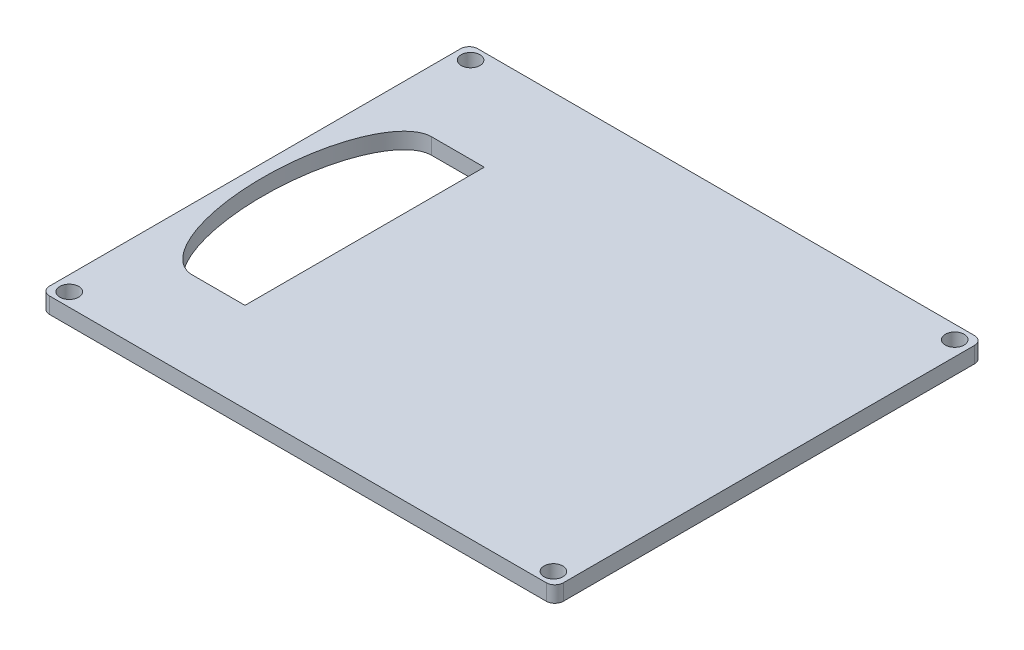
ISO-10303-21;
HEADER;
FILE_DESCRIPTION(('STEP AP214'),'2;1');
FILE_NAME('part.step','',(''),(''),'','','');
FILE_SCHEMA(('AUTOMOTIVE_DESIGN { 1 0 10303 214 1 1 1 1 }'));
ENDSEC;
DATA;
#1=APPLICATION_CONTEXT('core data for automotive mechanical design processes');
#2=APPLICATION_PROTOCOL_DEFINITION('international standard','automotive_design',2000,#1);
#3=PRODUCT_CONTEXT('',#1,'mechanical');
#4=PRODUCT('Part','Part','',(#3));
#5=PRODUCT_RELATED_PRODUCT_CATEGORY('part','',(#4));
#6=PRODUCT_DEFINITION_FORMATION('','',#4);
#7=PRODUCT_DEFINITION_CONTEXT('part definition',#1,'design');
#8=PRODUCT_DEFINITION('design','',#6,#7);
#9=PRODUCT_DEFINITION_SHAPE('','',#8);
#10=(LENGTH_UNIT() NAMED_UNIT(*) SI_UNIT(.MILLI.,.METRE.));
#11=(NAMED_UNIT(*) PLANE_ANGLE_UNIT() SI_UNIT($,.RADIAN.));
#12=(NAMED_UNIT(*) SI_UNIT($,.STERADIAN.) SOLID_ANGLE_UNIT());
#13=UNCERTAINTY_MEASURE_WITH_UNIT(LENGTH_MEASURE(1.E-05),#10,'distance_accuracy_value','');
#14=(GEOMETRIC_REPRESENTATION_CONTEXT(3) GLOBAL_UNCERTAINTY_ASSIGNED_CONTEXT((#13)) GLOBAL_UNIT_ASSIGNED_CONTEXT((#10,
#11,#12)) REPRESENTATION_CONTEXT('',''));
#15=CARTESIAN_POINT('',(0.,0.,0.));
#16=DIRECTION('',(0.,0.,1.));
#17=DIRECTION('',(1.,0.,0.));
#18=AXIS2_PLACEMENT_3D('',#15,#16,#17);
#19=CARTESIAN_POINT('',(76.2,4.7625,-63.5));
#20=DIRECTION('',(-1.,0.,0.));
#21=DIRECTION('',(0.,0.,1.));
#22=AXIS2_PLACEMENT_3D('',#19,#20,#21);
#23=PLANE('',#22);
#24=DIRECTION('',(0.,0.,-1.));
#25=VECTOR('',#24,1.);
#26=CARTESIAN_POINT('',(76.2,4.7625,-63.5));
#27=LINE('',#26,#25);
#28=CARTESIAN_POINT('',(76.2,4.7625,60.96));
#29=VERTEX_POINT('',#28);
#30=CARTESIAN_POINT('',(76.2,4.7625,-60.96));
#31=VERTEX_POINT('',#30);
#32=EDGE_CURVE('E189',#29,#31,#27,.T.);
#33=ORIENTED_EDGE('',*,*,#32,.F.);
#34=DIRECTION('',(0.,-1.,0.));
#35=VECTOR('',#34,1.);
#36=CARTESIAN_POINT('',(76.2,4.7625,60.96));
#37=LINE('',#36,#35);
#38=CARTESIAN_POINT('',(76.2,0.,60.96));
#39=VERTEX_POINT('',#38);
#40=EDGE_CURVE('E294',#29,#39,#37,.T.);
#41=ORIENTED_EDGE('',*,*,#40,.T.);
#42=DIRECTION('',(0.,0.,-1.));
#43=VECTOR('',#42,1.);
#44=CARTESIAN_POINT('',(76.2,0.,-63.5));
#45=LINE('',#44,#43);
#46=CARTESIAN_POINT('',(76.2,0.,-60.96));
#47=VERTEX_POINT('',#46);
#48=EDGE_CURVE('E186',#39,#47,#45,.T.);
#49=ORIENTED_EDGE('',*,*,#48,.T.);
#50=DIRECTION('',(0.,-1.,0.));
#51=VECTOR('',#50,1.);
#52=CARTESIAN_POINT('',(76.2,4.7625,-60.96));
#53=LINE('',#52,#51);
#54=EDGE_CURVE('E280',#47,#31,#53,.F.);
#55=ORIENTED_EDGE('',*,*,#54,.T.);
#56=EDGE_LOOP('',(#33,#41,#49,#55));
#57=FACE_BOUND('',#56,.T.);
#58=ADVANCED_FACE('F41',(#57),#23,.F.);
#59=CARTESIAN_POINT('',(-76.2,4.7625,-63.5));
#60=DIRECTION('',(0.,0.,1.));
#61=DIRECTION('',(1.,0.,0.));
#62=AXIS2_PLACEMENT_3D('',#59,#60,#61);
#63=PLANE('',#62);
#64=DIRECTION('',(-1.,0.,0.));
#65=VECTOR('',#64,1.);
#66=CARTESIAN_POINT('',(-76.2,4.7625,-63.5));
#67=LINE('',#66,#65);
#68=CARTESIAN_POINT('',(73.66,4.7625,-63.5));
#69=VERTEX_POINT('',#68);
#70=CARTESIAN_POINT('',(-73.66,4.7625,-63.5));
#71=VERTEX_POINT('',#70);
#72=EDGE_CURVE('E192',#69,#71,#67,.T.);
#73=ORIENTED_EDGE('',*,*,#72,.F.);
#74=DIRECTION('',(0.,-1.,0.));
#75=VECTOR('',#74,1.);
#76=CARTESIAN_POINT('',(73.66,4.7625,-63.5));
#77=LINE('',#76,#75);
#78=CARTESIAN_POINT('',(73.66,0.,-63.5));
#79=VERTEX_POINT('',#78);
#80=EDGE_CURVE('E12',#69,#79,#77,.T.);
#81=ORIENTED_EDGE('',*,*,#80,.T.);
#82=DIRECTION('',(-1.,0.,0.));
#83=VECTOR('',#82,1.);
#84=CARTESIAN_POINT('',(-76.2,0.,-63.5));
#85=LINE('',#84,#83);
#86=CARTESIAN_POINT('',(-73.66,0.,-63.5));
#87=VERTEX_POINT('',#86);
#88=EDGE_CURVE('E206',#79,#87,#85,.T.);
#89=ORIENTED_EDGE('',*,*,#88,.T.);
#90=DIRECTION('',(0.,-1.,0.));
#91=VECTOR('',#90,1.);
#92=CARTESIAN_POINT('',(-73.66,4.7625,-63.5));
#93=LINE('',#92,#91);
#94=EDGE_CURVE('E49',#87,#71,#93,.F.);
#95=ORIENTED_EDGE('',*,*,#94,.T.);
#96=EDGE_LOOP('',(#73,#81,#89,#95));
#97=FACE_BOUND('',#96,.T.);
#98=ADVANCED_FACE('F255',(#97),#63,.F.);
#99=CARTESIAN_POINT('',(-76.2,4.7625,-63.5));
#100=DIRECTION('',(1.,0.,0.));
#101=DIRECTION('',(0.,0.,-1.));
#102=AXIS2_PLACEMENT_3D('',#99,#100,#101);
#103=PLANE('',#102);
#104=DIRECTION('',(0.,0.,1.));
#105=VECTOR('',#104,1.);
#106=CARTESIAN_POINT('',(-76.2,0.,-63.5));
#107=LINE('',#106,#105);
#108=CARTESIAN_POINT('',(-76.2,0.,-60.96));
#109=VERTEX_POINT('',#108);
#110=CARTESIAN_POINT('',(-76.2,0.,60.96));
#111=VERTEX_POINT('',#110);
#112=EDGE_CURVE('E322',#109,#111,#107,.T.);
#113=ORIENTED_EDGE('',*,*,#112,.T.);
#114=DIRECTION('',(0.,-1.,0.));
#115=VECTOR('',#114,1.);
#116=CARTESIAN_POINT('',(-76.2,4.7625,60.96));
#117=LINE('',#116,#115);
#118=CARTESIAN_POINT('',(-76.2,4.7625,60.96));
#119=VERTEX_POINT('',#118);
#120=EDGE_CURVE('E288',#111,#119,#117,.F.);
#121=ORIENTED_EDGE('',*,*,#120,.T.);
#122=DIRECTION('',(0.,0.,1.));
#123=VECTOR('',#122,1.);
#124=CARTESIAN_POINT('',(-76.2,4.7625,-63.5));
#125=LINE('',#124,#123);
#126=CARTESIAN_POINT('',(-76.2,4.7625,-60.96));
#127=VERTEX_POINT('',#126);
#128=EDGE_CURVE('E196',#127,#119,#125,.T.);
#129=ORIENTED_EDGE('',*,*,#128,.F.);
#130=DIRECTION('',(0.,-1.,0.));
#131=VECTOR('',#130,1.);
#132=CARTESIAN_POINT('',(-76.2,4.7625,-60.96));
#133=LINE('',#132,#131);
#134=EDGE_CURVE('E303',#127,#109,#133,.T.);
#135=ORIENTED_EDGE('',*,*,#134,.T.);
#136=EDGE_LOOP('',(#113,#121,#129,#135));
#137=FACE_BOUND('',#136,.T.);
#138=ADVANCED_FACE('F251',(#137),#103,.F.);
#139=CARTESIAN_POINT('',(-76.2,4.7625,63.5));
#140=DIRECTION('',(0.,0.,-1.));
#141=DIRECTION('',(-1.,0.,0.));
#142=AXIS2_PLACEMENT_3D('',#139,#140,#141);
#143=PLANE('',#142);
#144=DIRECTION('',(1.,0.,0.));
#145=VECTOR('',#144,1.);
#146=CARTESIAN_POINT('',(-76.2,4.7625,63.5));
#147=LINE('',#146,#145);
#148=CARTESIAN_POINT('',(-73.66,4.7625,63.5));
#149=VERTEX_POINT('',#148);
#150=CARTESIAN_POINT('',(73.66,4.7625,63.5));
#151=VERTEX_POINT('',#150);
#152=EDGE_CURVE('E199',#149,#151,#147,.T.);
#153=ORIENTED_EDGE('',*,*,#152,.F.);
#154=DIRECTION('',(0.,-1.,0.));
#155=VECTOR('',#154,1.);
#156=CARTESIAN_POINT('',(-73.66,4.7625,63.5));
#157=LINE('',#156,#155);
#158=CARTESIAN_POINT('',(-73.66,0.,63.5));
#159=VERTEX_POINT('',#158);
#160=EDGE_CURVE('E316',#149,#159,#157,.T.);
#161=ORIENTED_EDGE('',*,*,#160,.T.);
#162=DIRECTION('',(1.,0.,0.));
#163=VECTOR('',#162,1.);
#164=CARTESIAN_POINT('',(-76.2,0.,63.5));
#165=LINE('',#164,#163);
#166=CARTESIAN_POINT('',(73.66,0.,63.5));
#167=VERTEX_POINT('',#166);
#168=EDGE_CURVE('E193',#159,#167,#165,.T.);
#169=ORIENTED_EDGE('',*,*,#168,.T.);
#170=DIRECTION('',(0.,-1.,0.));
#171=VECTOR('',#170,1.);
#172=CARTESIAN_POINT('',(73.66,4.7625,63.5));
#173=LINE('',#172,#171);
#174=EDGE_CURVE('E202',#167,#151,#173,.F.);
#175=ORIENTED_EDGE('',*,*,#174,.T.);
#176=EDGE_LOOP('',(#153,#161,#169,#175));
#177=FACE_BOUND('',#176,.T.);
#178=ADVANCED_FACE('F245',(#177),#143,.F.);
#179=CARTESIAN_POINT('',(0.,4.7625,0.));
#180=DIRECTION('',(0.,1.,0.));
#181=DIRECTION('',(0.,0.,1.));
#182=AXIS2_PLACEMENT_3D('',#179,#180,#181);
#183=PLANE('',#182);
#184=CARTESIAN_POINT('',(-57.8578913926201,4.7625,1.44007365035895));
#185=DIRECTION('',(0.,1.,0.));
#186=DIRECTION('',(0.,0.,1.));
#187=AXIS2_PLACEMENT_3D('',#184,#185,#186);
#188=ELLIPSE('',#187,35.4844500063675,14.605);
#189=CARTESIAN_POINT('',(-57.8578913926201,4.7625,-34.0443763560085));
#190=VERTEX_POINT('',#189);
#191=CARTESIAN_POINT('',(-57.8578913926201,4.7625,36.9245236567264));
#192=VERTEX_POINT('',#191);
#193=EDGE_CURVE('E56',#190,#192,#188,.T.);
#194=ORIENTED_EDGE('',*,*,#193,.F.);
#195=DIRECTION('',(-1.,0.,0.));
#196=VECTOR('',#195,1.);
#197=CARTESIAN_POINT('',(-57.8578913926201,4.7625,-34.0443763560085));
#198=LINE('',#197,#196);
#199=CARTESIAN_POINT('',(-42.2579164672201,4.7625,-34.0443763560085));
#200=VERTEX_POINT('',#199);
#201=EDGE_CURVE('E145',#200,#190,#198,.T.);
#202=ORIENTED_EDGE('',*,*,#201,.F.);
#203=DIRECTION('',(0.,0.,-1.));
#204=VECTOR('',#203,1.);
#205=CARTESIAN_POINT('',(-42.2579164672201,4.7625,-34.0443763560085));
#206=LINE('',#205,#204);
#207=CARTESIAN_POINT('',(-42.2579164672201,4.7625,36.9245236567264));
#208=VERTEX_POINT('',#207);
#209=EDGE_CURVE('E152',#208,#200,#206,.T.);
#210=ORIENTED_EDGE('',*,*,#209,.F.);
#211=DIRECTION('',(1.,0.,0.));
#212=VECTOR('',#211,1.);
#213=CARTESIAN_POINT('',(-57.8578913926201,4.7625,36.9245236567264));
#214=LINE('',#213,#212);
#215=EDGE_CURVE('E147',#192,#208,#214,.T.);
#216=ORIENTED_EDGE('',*,*,#215,.F.);
#217=EDGE_LOOP('',(#194,#202,#210,#216));
#218=FACE_BOUND('',#217,.T.);
#219=CARTESIAN_POINT('',(-71.7948137847569,4.7625,-59.5104358344753));
#220=DIRECTION('',(0.,-1.,0.));
#221=DIRECTION('',(0.,0.,1.));
#222=AXIS2_PLACEMENT_3D('',#219,#220,#221);
#223=CIRCLE('',#222,2.79400000031772);
#224=CARTESIAN_POINT('',(-71.7948137847569,4.7625,-56.7164358341575));
#225=VERTEX_POINT('',#224);
#226=EDGE_CURVE('E136',#225,#225,#223,.T.);
#227=ORIENTED_EDGE('',*,*,#226,.T.);
#228=EDGE_LOOP('',(#227));
#229=FACE_BOUND('',#228,.T.);
#230=CARTESIAN_POINT('',(-71.794813784757,4.7625,59.5104358344751));
#231=DIRECTION('',(0.,-1.,0.));
#232=DIRECTION('',(0.,0.,1.));
#233=AXIS2_PLACEMENT_3D('',#230,#231,#232);
#234=CIRCLE('',#233,2.79400000031772);
#235=CARTESIAN_POINT('',(-71.794813784757,4.7625,62.3044358347929));
#236=VERTEX_POINT('',#235);
#237=EDGE_CURVE('E168',#236,#236,#234,.T.);
#238=ORIENTED_EDGE('',*,*,#237,.T.);
#239=EDGE_LOOP('',(#238));
#240=FACE_BOUND('',#239,.T.);
#241=CARTESIAN_POINT('',(71.7948137847569,4.7625,-59.5104358344753));
#242=DIRECTION('',(0.,1.,0.));
#243=DIRECTION('',(0.,0.,1.));
#244=AXIS2_PLACEMENT_3D('',#241,#242,#243);
#245=CIRCLE('',#244,2.79400000031772);
#246=CARTESIAN_POINT('',(71.7948137847569,4.7625,-56.7164358341575));
#247=VERTEX_POINT('',#246);
#248=EDGE_CURVE('E174',#247,#247,#245,.T.);
#249=ORIENTED_EDGE('',*,*,#248,.F.);
#250=EDGE_LOOP('',(#249));
#251=FACE_BOUND('',#250,.T.);
#252=CARTESIAN_POINT('',(71.794813784757,4.7625,59.5104358344751));
#253=DIRECTION('',(0.,1.,0.));
#254=DIRECTION('',(0.,0.,1.));
#255=AXIS2_PLACEMENT_3D('',#252,#253,#254);
#256=CIRCLE('',#255,2.79400000031772);
#257=CARTESIAN_POINT('',(71.794813784757,4.7625,62.3044358347929));
#258=VERTEX_POINT('',#257);
#259=EDGE_CURVE('E180',#258,#258,#256,.T.);
#260=ORIENTED_EDGE('',*,*,#259,.F.);
#261=EDGE_LOOP('',(#260));
#262=FACE_BOUND('',#261,.T.);
#263=ORIENTED_EDGE('',*,*,#128,.T.);
#264=CARTESIAN_POINT('',(-73.66,4.7625,60.96));
#265=DIRECTION('',(0.,1.,0.));
#266=DIRECTION('',(0.,0.,1.));
#267=AXIS2_PLACEMENT_3D('',#264,#265,#266);
#268=CIRCLE('',#267,2.54);
#269=EDGE_CURVE('E286',#119,#149,#268,.T.);
#270=ORIENTED_EDGE('',*,*,#269,.T.);
#271=ORIENTED_EDGE('',*,*,#152,.T.);
#272=CARTESIAN_POINT('',(73.66,4.7625,60.96));
#273=DIRECTION('',(0.,1.,0.));
#274=DIRECTION('',(0.,0.,1.));
#275=AXIS2_PLACEMENT_3D('',#272,#273,#274);
#276=CIRCLE('',#275,2.54);
#277=EDGE_CURVE('E283',#151,#29,#276,.T.);
#278=ORIENTED_EDGE('',*,*,#277,.T.);
#279=ORIENTED_EDGE('',*,*,#32,.T.);
#280=CARTESIAN_POINT('',(73.66,4.7625,-60.96));
#281=DIRECTION('',(0.,1.,0.));
#282=DIRECTION('',(0.,0.,1.));
#283=AXIS2_PLACEMENT_3D('',#280,#281,#282);
#284=CIRCLE('',#283,2.54);
#285=EDGE_CURVE('E279',#31,#69,#284,.T.);
#286=ORIENTED_EDGE('',*,*,#285,.T.);
#287=ORIENTED_EDGE('',*,*,#72,.T.);
#288=CARTESIAN_POINT('',(-73.66,4.7625,-60.96));
#289=DIRECTION('',(0.,1.,0.));
#290=DIRECTION('',(0.,0.,1.));
#291=AXIS2_PLACEMENT_3D('',#288,#289,#290);
#292=CIRCLE('',#291,2.54);
#293=EDGE_CURVE('E284',#71,#127,#292,.T.);
#294=ORIENTED_EDGE('',*,*,#293,.T.);
#295=EDGE_LOOP('',(#263,#270,#271,#278,#279,#286,#287,#294));
#296=FACE_BOUND('',#295,.T.);
#297=ADVANCED_FACE('F142',(#218,#229,#240,#251,#262,#296),#183,.T.);
#298=CARTESIAN_POINT('',(0.,0.,0.));
#299=DIRECTION('',(0.,1.,0.));
#300=DIRECTION('',(0.,0.,1.));
#301=AXIS2_PLACEMENT_3D('',#298,#299,#300);
#302=PLANE('',#301);
#303=DIRECTION('',(-1.,0.,0.));
#304=VECTOR('',#303,1.);
#305=CARTESIAN_POINT('',(-57.8578913926201,0.,-34.0443763560085));
#306=LINE('',#305,#304);
#307=CARTESIAN_POINT('',(-42.2579164672201,0.,-34.0443763560085));
#308=VERTEX_POINT('',#307);
#309=CARTESIAN_POINT('',(-57.8578913926201,0.,-34.0443763560085));
#310=VERTEX_POINT('',#309);
#311=EDGE_CURVE('E164',#308,#310,#306,.T.);
#312=ORIENTED_EDGE('',*,*,#311,.T.);
#313=CARTESIAN_POINT('',(-57.8578913926201,0.,1.44007365035895));
#314=DIRECTION('',(0.,1.,0.));
#315=DIRECTION('',(0.,0.,1.));
#316=AXIS2_PLACEMENT_3D('',#313,#314,#315);
#317=ELLIPSE('',#316,35.4844500063675,14.605);
#318=CARTESIAN_POINT('',(-57.8578913926201,0.,36.9245236567264));
#319=VERTEX_POINT('',#318);
#320=EDGE_CURVE('E131',#310,#319,#317,.T.);
#321=ORIENTED_EDGE('',*,*,#320,.T.);
#322=DIRECTION('',(1.,0.,0.));
#323=VECTOR('',#322,1.);
#324=CARTESIAN_POINT('',(-57.8578913926201,0.,36.9245236567264));
#325=LINE('',#324,#323);
#326=CARTESIAN_POINT('',(-42.2579164672201,0.,36.9245236567264));
#327=VERTEX_POINT('',#326);
#328=EDGE_CURVE('E151',#319,#327,#325,.T.);
#329=ORIENTED_EDGE('',*,*,#328,.T.);
#330=DIRECTION('',(0.,0.,-1.));
#331=VECTOR('',#330,1.);
#332=CARTESIAN_POINT('',(-42.2579164672201,0.,-34.0443763560085));
#333=LINE('',#332,#331);
#334=EDGE_CURVE('E64',#327,#308,#333,.T.);
#335=ORIENTED_EDGE('',*,*,#334,.T.);
#336=EDGE_LOOP('',(#312,#321,#329,#335));
#337=FACE_BOUND('',#336,.T.);
#338=CARTESIAN_POINT('',(-71.7948137847569,0.,-59.5104358344753));
#339=DIRECTION('',(0.,-1.,0.));
#340=DIRECTION('',(0.,0.,1.));
#341=AXIS2_PLACEMENT_3D('',#338,#339,#340);
#342=CIRCLE('',#341,2.79400000031772);
#343=CARTESIAN_POINT('',(-71.7948137847569,0.,-56.7164358341575));
#344=VERTEX_POINT('',#343);
#345=EDGE_CURVE('E165',#344,#344,#342,.T.);
#346=ORIENTED_EDGE('',*,*,#345,.F.);
#347=EDGE_LOOP('',(#346));
#348=FACE_BOUND('',#347,.T.);
#349=CARTESIAN_POINT('',(-71.794813784757,0.,59.5104358344751));
#350=DIRECTION('',(0.,-1.,0.));
#351=DIRECTION('',(0.,0.,1.));
#352=AXIS2_PLACEMENT_3D('',#349,#350,#351);
#353=CIRCLE('',#352,2.79400000031772);
#354=CARTESIAN_POINT('',(-71.794813784757,0.,62.3044358347929));
#355=VERTEX_POINT('',#354);
#356=EDGE_CURVE('E171',#355,#355,#353,.T.);
#357=ORIENTED_EDGE('',*,*,#356,.F.);
#358=EDGE_LOOP('',(#357));
#359=FACE_BOUND('',#358,.T.);
#360=CARTESIAN_POINT('',(71.7948137847569,0.,-59.5104358344753));
#361=DIRECTION('',(0.,1.,0.));
#362=DIRECTION('',(0.,0.,1.));
#363=AXIS2_PLACEMENT_3D('',#360,#361,#362);
#364=CIRCLE('',#363,2.79400000031772);
#365=CARTESIAN_POINT('',(71.7948137847569,0.,-56.7164358341575));
#366=VERTEX_POINT('',#365);
#367=EDGE_CURVE('E177',#366,#366,#364,.T.);
#368=ORIENTED_EDGE('',*,*,#367,.T.);
#369=EDGE_LOOP('',(#368));
#370=FACE_BOUND('',#369,.T.);
#371=CARTESIAN_POINT('',(71.794813784757,0.,59.5104358344751));
#372=DIRECTION('',(0.,1.,0.));
#373=DIRECTION('',(0.,0.,1.));
#374=AXIS2_PLACEMENT_3D('',#371,#372,#373);
#375=CIRCLE('',#374,2.79400000031772);
#376=CARTESIAN_POINT('',(71.794813784757,0.,62.3044358347929));
#377=VERTEX_POINT('',#376);
#378=EDGE_CURVE('E183',#377,#377,#375,.T.);
#379=ORIENTED_EDGE('',*,*,#378,.T.);
#380=EDGE_LOOP('',(#379));
#381=FACE_BOUND('',#380,.T.);
#382=ORIENTED_EDGE('',*,*,#168,.F.);
#383=CARTESIAN_POINT('',(-73.66,0.,60.96));
#384=DIRECTION('',(0.,1.,0.));
#385=DIRECTION('',(0.,0.,1.));
#386=AXIS2_PLACEMENT_3D('',#383,#384,#385);
#387=CIRCLE('',#386,2.54);
#388=EDGE_CURVE('E307',#159,#111,#387,.F.);
#389=ORIENTED_EDGE('',*,*,#388,.T.);
#390=ORIENTED_EDGE('',*,*,#112,.F.);
#391=CARTESIAN_POINT('',(-73.66,0.,-60.96));
#392=DIRECTION('',(0.,1.,0.));
#393=DIRECTION('',(0.,0.,1.));
#394=AXIS2_PLACEMENT_3D('',#391,#392,#393);
#395=CIRCLE('',#394,2.54);
#396=EDGE_CURVE('E304',#109,#87,#395,.F.);
#397=ORIENTED_EDGE('',*,*,#396,.T.);
#398=ORIENTED_EDGE('',*,*,#88,.F.);
#399=CARTESIAN_POINT('',(73.66,0.,-60.96));
#400=DIRECTION('',(0.,1.,0.));
#401=DIRECTION('',(0.,0.,1.));
#402=AXIS2_PLACEMENT_3D('',#399,#400,#401);
#403=CIRCLE('',#402,2.54);
#404=EDGE_CURVE('E313',#79,#47,#403,.F.);
#405=ORIENTED_EDGE('',*,*,#404,.T.);
#406=ORIENTED_EDGE('',*,*,#48,.F.);
#407=CARTESIAN_POINT('',(73.66,0.,60.96));
#408=DIRECTION('',(0.,1.,0.));
#409=DIRECTION('',(0.,0.,1.));
#410=AXIS2_PLACEMENT_3D('',#407,#408,#409);
#411=CIRCLE('',#410,2.54);
#412=EDGE_CURVE('E309',#39,#167,#411,.F.);
#413=ORIENTED_EDGE('',*,*,#412,.T.);
#414=EDGE_LOOP('',(#382,#389,#390,#397,#398,#405,#406,#413));
#415=FACE_BOUND('',#414,.T.);
#416=ADVANCED_FACE('F241',(#337,#348,#359,#370,#381,#415),#302,.F.);
#417=CARTESIAN_POINT('',(71.794813784757,0.,59.5104358344751));
#418=DIRECTION('',(0.,1.,0.));
#419=DIRECTION('',(0.,0.,1.));
#420=AXIS2_PLACEMENT_3D('',#417,#418,#419);
#421=CYLINDRICAL_SURFACE('',#420,2.79400000031772);
#422=CARTESIAN_POINT('',(71.794813784757,0.,62.3044358347929));
#423=CARTESIAN_POINT('',(71.794813784757,0.049609375,62.3044358347929));
#424=CARTESIAN_POINT('',(71.794813784757,0.09921875,62.3044358347929));
#425=CARTESIAN_POINT('',(71.794813784757,0.1984375,62.3044358347929));
#426=CARTESIAN_POINT('',(71.794813784757,0.248046875,62.3044358347929));
#427=CARTESIAN_POINT('',(71.794813784757,0.347265625,62.3044358347929));
#428=CARTESIAN_POINT('',(71.794813784757,0.396875,62.3044358347929));
#429=CARTESIAN_POINT('',(71.794813784757,0.49609375,62.3044358347929));
#430=CARTESIAN_POINT('',(71.794813784757,0.545703125,62.3044358347929));
#431=CARTESIAN_POINT('',(71.794813784757,0.644921875,62.3044358347929));
#432=CARTESIAN_POINT('',(71.794813784757,0.69453125,62.3044358347929));
#433=CARTESIAN_POINT('',(71.794813784757,0.79375,62.3044358347929));
#434=CARTESIAN_POINT('',(71.794813784757,0.843359375,62.3044358347929));
#435=CARTESIAN_POINT('',(71.794813784757,0.942578125,62.3044358347929));
#436=CARTESIAN_POINT('',(71.794813784757,0.9921875,62.3044358347929));
#437=CARTESIAN_POINT('',(71.794813784757,1.09140625,62.3044358347929));
#438=CARTESIAN_POINT('',(71.794813784757,1.141015625,62.3044358347929));
#439=CARTESIAN_POINT('',(71.794813784757,1.240234375,62.3044358347929));
#440=CARTESIAN_POINT('',(71.794813784757,1.28984375,62.3044358347929));
#441=CARTESIAN_POINT('',(71.794813784757,1.3890625,62.3044358347929));
#442=CARTESIAN_POINT('',(71.794813784757,1.438671875,62.3044358347929));
#443=CARTESIAN_POINT('',(71.794813784757,1.537890625,62.3044358347929));
#444=CARTESIAN_POINT('',(71.794813784757,1.5875,62.3044358347929));
#445=CARTESIAN_POINT('',(71.794813784757,1.68671875,62.3044358347929));
#446=CARTESIAN_POINT('',(71.794813784757,1.736328125,62.3044358347929));
#447=CARTESIAN_POINT('',(71.794813784757,1.835546875,62.3044358347929));
#448=CARTESIAN_POINT('',(71.794813784757,1.88515625,62.3044358347929));
#449=CARTESIAN_POINT('',(71.794813784757,1.984375,62.3044358347929));
#450=CARTESIAN_POINT('',(71.794813784757,2.033984375,62.3044358347929));
#451=CARTESIAN_POINT('',(71.794813784757,2.133203125,62.3044358347929));
#452=CARTESIAN_POINT('',(71.794813784757,2.1828125,62.3044358347929));
#453=CARTESIAN_POINT('',(71.794813784757,2.28203125,62.3044358347929));
#454=CARTESIAN_POINT('',(71.794813784757,2.331640625,62.3044358347929));
#455=CARTESIAN_POINT('',(71.794813784757,2.430859375,62.3044358347929));
#456=CARTESIAN_POINT('',(71.794813784757,2.48046875,62.3044358347929));
#457=CARTESIAN_POINT('',(71.794813784757,2.5796875,62.3044358347929));
#458=CARTESIAN_POINT('',(71.794813784757,2.629296875,62.3044358347929));
#459=CARTESIAN_POINT('',(71.794813784757,2.728515625,62.3044358347929));
#460=CARTESIAN_POINT('',(71.794813784757,2.778125,62.3044358347929));
#461=CARTESIAN_POINT('',(71.794813784757,2.87734375,62.3044358347929));
#462=CARTESIAN_POINT('',(71.794813784757,2.926953125,62.3044358347929));
#463=CARTESIAN_POINT('',(71.794813784757,3.026171875,62.3044358347929));
#464=CARTESIAN_POINT('',(71.794813784757,3.07578125,62.3044358347929));
#465=CARTESIAN_POINT('',(71.794813784757,3.175,62.3044358347929));
#466=CARTESIAN_POINT('',(71.794813784757,3.224609375,62.3044358347929));
#467=CARTESIAN_POINT('',(71.794813784757,3.323828125,62.3044358347929));
#468=CARTESIAN_POINT('',(71.794813784757,3.3734375,62.3044358347929));
#469=CARTESIAN_POINT('',(71.794813784757,3.47265625,62.3044358347929));
#470=CARTESIAN_POINT('',(71.794813784757,3.522265625,62.3044358347929));
#471=CARTESIAN_POINT('',(71.794813784757,3.621484375,62.3044358347929));
#472=CARTESIAN_POINT('',(71.794813784757,3.67109375,62.3044358347929));
#473=CARTESIAN_POINT('',(71.794813784757,3.7703125,62.3044358347929));
#474=CARTESIAN_POINT('',(71.794813784757,3.819921875,62.3044358347929));
#475=CARTESIAN_POINT('',(71.794813784757,3.919140625,62.3044358347929));
#476=CARTESIAN_POINT('',(71.794813784757,3.96875,62.3044358347929));
#477=CARTESIAN_POINT('',(71.794813784757,4.06796875,62.3044358347929));
#478=CARTESIAN_POINT('',(71.794813784757,4.117578125,62.3044358347929));
#479=CARTESIAN_POINT('',(71.794813784757,4.216796875,62.3044358347929));
#480=CARTESIAN_POINT('',(71.794813784757,4.26640625,62.3044358347929));
#481=CARTESIAN_POINT('',(71.794813784757,4.365625,62.3044358347929));
#482=CARTESIAN_POINT('',(71.794813784757,4.415234375,62.3044358347929));
#483=CARTESIAN_POINT('',(71.794813784757,4.514453125,62.3044358347929));
#484=CARTESIAN_POINT('',(71.794813784757,4.5640625,62.3044358347929));
#485=CARTESIAN_POINT('',(71.794813784757,4.66328125,62.3044358347929));
#486=CARTESIAN_POINT('',(71.794813784757,4.712890625,62.3044358347929));
#487=CARTESIAN_POINT('',(71.794813784757,4.7625,62.3044358347929));
#488=B_SPLINE_CURVE_WITH_KNOTS('',3,(#422,#423,#424,#425,#426,#427,#428,#429,#430,#431,#432,
#433,#434,#435,#436,#437,#438,#439,#440,#441,#442,#443,#444,#445,#446,#447,#448,#449,#450,#451,
#452,#453,#454,#455,#456,#457,#458,#459,#460,#461,#462,#463,#464,#465,#466,#467,#468,#469,#470,
#471,#472,#473,#474,#475,#476,#477,#478,#479,#480,#481,#482,#483,#484,#485,#486,#487),
.UNSPECIFIED.,.F.,.F.,(4,2,2,2,2,2,2,2,2,2,2,2,2,2,2,2,2,2,2,2,2,2,2,2,2,2,2,2,2,2,2,2,4),(0.,
0.148828125,0.29765625,0.446484375,0.5953125,0.744140625,0.89296875,1.041796875,1.190625,
1.339453125,1.48828125,1.637109375,1.7859375,1.934765625,2.08359375,2.232421875,2.38125,
2.530078125,2.67890625,2.827734375,2.9765625,3.125390625,3.27421875,3.423046875,3.571875,
3.720703125,3.86953125,4.018359375,4.1671875,4.316015625,4.46484375,4.613671875,4.7625),.UNSPECIFIED.);
#489=EDGE_CURVE('BSEAM237',#377,#258,#488,.T.);
#490=ORIENTED_EDGE('',*,*,#378,.F.);
#491=ORIENTED_EDGE('',*,*,#259,.T.);
#492=ORIENTED_EDGE('',*,*,#489,.T.);
#493=ORIENTED_EDGE('',*,*,#489,.F.);
#494=EDGE_LOOP('',(#490,#492,#491,#493));
#495=FACE_BOUND('',#494,.T.);
#496=ADVANCED_FACE('F237',(#495),#421,.F.);
#497=CARTESIAN_POINT('',(71.7948137847569,0.,-59.5104358344753));
#498=DIRECTION('',(0.,1.,0.));
#499=DIRECTION('',(0.,0.,1.));
#500=AXIS2_PLACEMENT_3D('',#497,#498,#499);
#501=CYLINDRICAL_SURFACE('',#500,2.79400000031772);
#502=CARTESIAN_POINT('',(71.7948137847569,0.,-56.7164358341575));
#503=CARTESIAN_POINT('',(71.7948137847569,0.049609375,-56.7164358341575));
#504=CARTESIAN_POINT('',(71.7948137847569,0.09921875,-56.7164358341575));
#505=CARTESIAN_POINT('',(71.7948137847569,0.1984375,-56.7164358341575));
#506=CARTESIAN_POINT('',(71.7948137847569,0.248046875,-56.7164358341575));
#507=CARTESIAN_POINT('',(71.7948137847569,0.347265625,-56.7164358341575));
#508=CARTESIAN_POINT('',(71.7948137847569,0.396875,-56.7164358341575));
#509=CARTESIAN_POINT('',(71.7948137847569,0.49609375,-56.7164358341575));
#510=CARTESIAN_POINT('',(71.7948137847569,0.545703125,-56.7164358341575));
#511=CARTESIAN_POINT('',(71.7948137847569,0.644921875,-56.7164358341575));
#512=CARTESIAN_POINT('',(71.7948137847569,0.69453125,-56.7164358341575));
#513=CARTESIAN_POINT('',(71.7948137847569,0.79375,-56.7164358341575));
#514=CARTESIAN_POINT('',(71.7948137847569,0.843359375,-56.7164358341575));
#515=CARTESIAN_POINT('',(71.7948137847569,0.942578125,-56.7164358341575));
#516=CARTESIAN_POINT('',(71.7948137847569,0.9921875,-56.7164358341575));
#517=CARTESIAN_POINT('',(71.7948137847569,1.09140625,-56.7164358341575));
#518=CARTESIAN_POINT('',(71.7948137847569,1.141015625,-56.7164358341575));
#519=CARTESIAN_POINT('',(71.7948137847569,1.240234375,-56.7164358341575));
#520=CARTESIAN_POINT('',(71.7948137847569,1.28984375,-56.7164358341575));
#521=CARTESIAN_POINT('',(71.7948137847569,1.3890625,-56.7164358341575));
#522=CARTESIAN_POINT('',(71.7948137847569,1.438671875,-56.7164358341575));
#523=CARTESIAN_POINT('',(71.7948137847569,1.537890625,-56.7164358341575));
#524=CARTESIAN_POINT('',(71.7948137847569,1.5875,-56.7164358341575));
#525=CARTESIAN_POINT('',(71.7948137847569,1.68671875,-56.7164358341575));
#526=CARTESIAN_POINT('',(71.7948137847569,1.736328125,-56.7164358341575));
#527=CARTESIAN_POINT('',(71.7948137847569,1.835546875,-56.7164358341575));
#528=CARTESIAN_POINT('',(71.7948137847569,1.88515625,-56.7164358341575));
#529=CARTESIAN_POINT('',(71.7948137847569,1.984375,-56.7164358341575));
#530=CARTESIAN_POINT('',(71.7948137847569,2.033984375,-56.7164358341575));
#531=CARTESIAN_POINT('',(71.7948137847569,2.133203125,-56.7164358341575));
#532=CARTESIAN_POINT('',(71.7948137847569,2.1828125,-56.7164358341575));
#533=CARTESIAN_POINT('',(71.7948137847569,2.28203125,-56.7164358341575));
#534=CARTESIAN_POINT('',(71.7948137847569,2.331640625,-56.7164358341575));
#535=CARTESIAN_POINT('',(71.7948137847569,2.430859375,-56.7164358341575));
#536=CARTESIAN_POINT('',(71.7948137847569,2.48046875,-56.7164358341575));
#537=CARTESIAN_POINT('',(71.7948137847569,2.5796875,-56.7164358341575));
#538=CARTESIAN_POINT('',(71.7948137847569,2.629296875,-56.7164358341575));
#539=CARTESIAN_POINT('',(71.7948137847569,2.728515625,-56.7164358341575));
#540=CARTESIAN_POINT('',(71.7948137847569,2.778125,-56.7164358341575));
#541=CARTESIAN_POINT('',(71.7948137847569,2.87734375,-56.7164358341575));
#542=CARTESIAN_POINT('',(71.7948137847569,2.926953125,-56.7164358341575));
#543=CARTESIAN_POINT('',(71.7948137847569,3.026171875,-56.7164358341575));
#544=CARTESIAN_POINT('',(71.7948137847569,3.07578125,-56.7164358341575));
#545=CARTESIAN_POINT('',(71.7948137847569,3.175,-56.7164358341575));
#546=CARTESIAN_POINT('',(71.7948137847569,3.224609375,-56.7164358341575));
#547=CARTESIAN_POINT('',(71.7948137847569,3.323828125,-56.7164358341575));
#548=CARTESIAN_POINT('',(71.7948137847569,3.3734375,-56.7164358341575));
#549=CARTESIAN_POINT('',(71.7948137847569,3.47265625,-56.7164358341575));
#550=CARTESIAN_POINT('',(71.7948137847569,3.522265625,-56.7164358341575));
#551=CARTESIAN_POINT('',(71.7948137847569,3.621484375,-56.7164358341575));
#552=CARTESIAN_POINT('',(71.7948137847569,3.67109375,-56.7164358341575));
#553=CARTESIAN_POINT('',(71.7948137847569,3.7703125,-56.7164358341575));
#554=CARTESIAN_POINT('',(71.7948137847569,3.819921875,-56.7164358341575));
#555=CARTESIAN_POINT('',(71.7948137847569,3.919140625,-56.7164358341575));
#556=CARTESIAN_POINT('',(71.7948137847569,3.96875,-56.7164358341575));
#557=CARTESIAN_POINT('',(71.7948137847569,4.06796875,-56.7164358341575));
#558=CARTESIAN_POINT('',(71.7948137847569,4.117578125,-56.7164358341575));
#559=CARTESIAN_POINT('',(71.7948137847569,4.216796875,-56.7164358341575));
#560=CARTESIAN_POINT('',(71.7948137847569,4.26640625,-56.7164358341575));
#561=CARTESIAN_POINT('',(71.7948137847569,4.365625,-56.7164358341575));
#562=CARTESIAN_POINT('',(71.7948137847569,4.415234375,-56.7164358341575));
#563=CARTESIAN_POINT('',(71.7948137847569,4.514453125,-56.7164358341575));
#564=CARTESIAN_POINT('',(71.7948137847569,4.5640625,-56.7164358341575));
#565=CARTESIAN_POINT('',(71.7948137847569,4.66328125,-56.7164358341575));
#566=CARTESIAN_POINT('',(71.7948137847569,4.712890625,-56.7164358341575));
#567=CARTESIAN_POINT('',(71.7948137847569,4.7625,-56.7164358341575));
#568=B_SPLINE_CURVE_WITH_KNOTS('',3,(#502,#503,#504,#505,#506,#507,#508,#509,#510,#511,#512,
#513,#514,#515,#516,#517,#518,#519,#520,#521,#522,#523,#524,#525,#526,#527,#528,#529,#530,#531,
#532,#533,#534,#535,#536,#537,#538,#539,#540,#541,#542,#543,#544,#545,#546,#547,#548,#549,#550,
#551,#552,#553,#554,#555,#556,#557,#558,#559,#560,#561,#562,#563,#564,#565,#566,#567),
.UNSPECIFIED.,.F.,.F.,(4,2,2,2,2,2,2,2,2,2,2,2,2,2,2,2,2,2,2,2,2,2,2,2,2,2,2,2,2,2,2,2,4),(0.,
0.148828125,0.29765625,0.446484375,0.5953125,0.744140625,0.89296875,1.041796875,1.190625,
1.339453125,1.48828125,1.637109375,1.7859375,1.934765625,2.08359375,2.232421875,2.38125,
2.530078125,2.67890625,2.827734375,2.9765625,3.125390625,3.27421875,3.423046875,3.571875,
3.720703125,3.86953125,4.018359375,4.1671875,4.316015625,4.46484375,4.613671875,4.7625),.UNSPECIFIED.);
#569=EDGE_CURVE('BSEAM233',#366,#247,#568,.T.);
#570=ORIENTED_EDGE('',*,*,#367,.F.);
#571=ORIENTED_EDGE('',*,*,#248,.T.);
#572=ORIENTED_EDGE('',*,*,#569,.T.);
#573=ORIENTED_EDGE('',*,*,#569,.F.);
#574=EDGE_LOOP('',(#570,#572,#571,#573));
#575=FACE_BOUND('',#574,.T.);
#576=ADVANCED_FACE('F233',(#575),#501,.F.);
#577=CARTESIAN_POINT('',(-71.794813784757,0.,59.5104358344751));
#578=DIRECTION('',(0.,1.,0.));
#579=DIRECTION('',(0.,0.,1.));
#580=AXIS2_PLACEMENT_3D('',#577,#578,#579);
#581=CYLINDRICAL_SURFACE('',#580,2.79400000031772);
#582=CARTESIAN_POINT('',(-71.794813784757,0.,62.3044358347929));
#583=CARTESIAN_POINT('',(-71.794813784757,0.049609375,62.3044358347929));
#584=CARTESIAN_POINT('',(-71.794813784757,0.09921875,62.3044358347929));
#585=CARTESIAN_POINT('',(-71.794813784757,0.1984375,62.3044358347929));
#586=CARTESIAN_POINT('',(-71.794813784757,0.248046875,62.3044358347929));
#587=CARTESIAN_POINT('',(-71.794813784757,0.347265625,62.3044358347929));
#588=CARTESIAN_POINT('',(-71.794813784757,0.396875,62.3044358347929));
#589=CARTESIAN_POINT('',(-71.794813784757,0.49609375,62.3044358347929));
#590=CARTESIAN_POINT('',(-71.794813784757,0.545703125,62.3044358347929));
#591=CARTESIAN_POINT('',(-71.794813784757,0.644921875,62.3044358347929));
#592=CARTESIAN_POINT('',(-71.794813784757,0.69453125,62.3044358347929));
#593=CARTESIAN_POINT('',(-71.794813784757,0.79375,62.3044358347929));
#594=CARTESIAN_POINT('',(-71.794813784757,0.843359375,62.3044358347929));
#595=CARTESIAN_POINT('',(-71.794813784757,0.942578125,62.3044358347929));
#596=CARTESIAN_POINT('',(-71.794813784757,0.9921875,62.3044358347929));
#597=CARTESIAN_POINT('',(-71.794813784757,1.09140625,62.3044358347929));
#598=CARTESIAN_POINT('',(-71.794813784757,1.141015625,62.3044358347929));
#599=CARTESIAN_POINT('',(-71.794813784757,1.240234375,62.3044358347929));
#600=CARTESIAN_POINT('',(-71.794813784757,1.28984375,62.3044358347929));
#601=CARTESIAN_POINT('',(-71.794813784757,1.3890625,62.3044358347929));
#602=CARTESIAN_POINT('',(-71.794813784757,1.438671875,62.3044358347929));
#603=CARTESIAN_POINT('',(-71.794813784757,1.537890625,62.3044358347929));
#604=CARTESIAN_POINT('',(-71.794813784757,1.5875,62.3044358347929));
#605=CARTESIAN_POINT('',(-71.794813784757,1.68671875,62.3044358347929));
#606=CARTESIAN_POINT('',(-71.794813784757,1.736328125,62.3044358347929));
#607=CARTESIAN_POINT('',(-71.794813784757,1.835546875,62.3044358347929));
#608=CARTESIAN_POINT('',(-71.794813784757,1.88515625,62.3044358347929));
#609=CARTESIAN_POINT('',(-71.794813784757,1.984375,62.3044358347929));
#610=CARTESIAN_POINT('',(-71.794813784757,2.033984375,62.3044358347929));
#611=CARTESIAN_POINT('',(-71.794813784757,2.133203125,62.3044358347929));
#612=CARTESIAN_POINT('',(-71.794813784757,2.1828125,62.3044358347929));
#613=CARTESIAN_POINT('',(-71.794813784757,2.28203125,62.3044358347929));
#614=CARTESIAN_POINT('',(-71.794813784757,2.331640625,62.3044358347929));
#615=CARTESIAN_POINT('',(-71.794813784757,2.430859375,62.3044358347929));
#616=CARTESIAN_POINT('',(-71.794813784757,2.48046875,62.3044358347929));
#617=CARTESIAN_POINT('',(-71.794813784757,2.5796875,62.3044358347929));
#618=CARTESIAN_POINT('',(-71.794813784757,2.629296875,62.3044358347929));
#619=CARTESIAN_POINT('',(-71.794813784757,2.728515625,62.3044358347929));
#620=CARTESIAN_POINT('',(-71.794813784757,2.778125,62.3044358347929));
#621=CARTESIAN_POINT('',(-71.794813784757,2.87734375,62.3044358347929));
#622=CARTESIAN_POINT('',(-71.794813784757,2.926953125,62.3044358347929));
#623=CARTESIAN_POINT('',(-71.794813784757,3.026171875,62.3044358347929));
#624=CARTESIAN_POINT('',(-71.794813784757,3.07578125,62.3044358347929));
#625=CARTESIAN_POINT('',(-71.794813784757,3.175,62.3044358347929));
#626=CARTESIAN_POINT('',(-71.794813784757,3.224609375,62.3044358347929));
#627=CARTESIAN_POINT('',(-71.794813784757,3.323828125,62.3044358347929));
#628=CARTESIAN_POINT('',(-71.794813784757,3.3734375,62.3044358347929));
#629=CARTESIAN_POINT('',(-71.794813784757,3.47265625,62.3044358347929));
#630=CARTESIAN_POINT('',(-71.794813784757,3.522265625,62.3044358347929));
#631=CARTESIAN_POINT('',(-71.794813784757,3.621484375,62.3044358347929));
#632=CARTESIAN_POINT('',(-71.794813784757,3.67109375,62.3044358347929));
#633=CARTESIAN_POINT('',(-71.794813784757,3.7703125,62.3044358347929));
#634=CARTESIAN_POINT('',(-71.794813784757,3.819921875,62.3044358347929));
#635=CARTESIAN_POINT('',(-71.794813784757,3.919140625,62.3044358347929));
#636=CARTESIAN_POINT('',(-71.794813784757,3.96875,62.3044358347929));
#637=CARTESIAN_POINT('',(-71.794813784757,4.06796875,62.3044358347929));
#638=CARTESIAN_POINT('',(-71.794813784757,4.117578125,62.3044358347929));
#639=CARTESIAN_POINT('',(-71.794813784757,4.216796875,62.3044358347929));
#640=CARTESIAN_POINT('',(-71.794813784757,4.26640625,62.3044358347929));
#641=CARTESIAN_POINT('',(-71.794813784757,4.365625,62.3044358347929));
#642=CARTESIAN_POINT('',(-71.794813784757,4.415234375,62.3044358347929));
#643=CARTESIAN_POINT('',(-71.794813784757,4.514453125,62.3044358347929));
#644=CARTESIAN_POINT('',(-71.794813784757,4.5640625,62.3044358347929));
#645=CARTESIAN_POINT('',(-71.794813784757,4.66328125,62.3044358347929));
#646=CARTESIAN_POINT('',(-71.794813784757,4.712890625,62.3044358347929));
#647=CARTESIAN_POINT('',(-71.794813784757,4.7625,62.3044358347929));
#648=B_SPLINE_CURVE_WITH_KNOTS('',3,(#582,#583,#584,#585,#586,#587,#588,#589,#590,#591,#592,
#593,#594,#595,#596,#597,#598,#599,#600,#601,#602,#603,#604,#605,#606,#607,#608,#609,#610,#611,
#612,#613,#614,#615,#616,#617,#618,#619,#620,#621,#622,#623,#624,#625,#626,#627,#628,#629,#630,
#631,#632,#633,#634,#635,#636,#637,#638,#639,#640,#641,#642,#643,#644,#645,#646,#647),
.UNSPECIFIED.,.F.,.F.,(4,2,2,2,2,2,2,2,2,2,2,2,2,2,2,2,2,2,2,2,2,2,2,2,2,2,2,2,2,2,2,2,4),(0.,
0.148828125,0.29765625,0.446484375,0.5953125,0.744140625,0.89296875,1.041796875,1.190625,
1.339453125,1.48828125,1.637109375,1.7859375,1.934765625,2.08359375,2.232421875,2.38125,
2.530078125,2.67890625,2.827734375,2.9765625,3.125390625,3.27421875,3.423046875,3.571875,
3.720703125,3.86953125,4.018359375,4.1671875,4.316015625,4.46484375,4.613671875,4.7625),.UNSPECIFIED.);
#649=EDGE_CURVE('BSEAM229',#355,#236,#648,.T.);
#650=ORIENTED_EDGE('',*,*,#356,.T.);
#651=ORIENTED_EDGE('',*,*,#237,.F.);
#652=ORIENTED_EDGE('',*,*,#649,.T.);
#653=ORIENTED_EDGE('',*,*,#649,.F.);
#654=EDGE_LOOP('',(#650,#652,#651,#653));
#655=FACE_BOUND('',#654,.T.);
#656=ADVANCED_FACE('F229',(#655),#581,.F.);
#657=CARTESIAN_POINT('',(-71.7948137847569,0.,-59.5104358344753));
#658=DIRECTION('',(0.,1.,0.));
#659=DIRECTION('',(0.,0.,1.));
#660=AXIS2_PLACEMENT_3D('',#657,#658,#659);
#661=CYLINDRICAL_SURFACE('',#660,2.79400000031772);
#662=CARTESIAN_POINT('',(-71.7948137847569,0.,-56.7164358341575));
#663=CARTESIAN_POINT('',(-71.7948137847569,0.049609375,-56.7164358341575));
#664=CARTESIAN_POINT('',(-71.7948137847569,0.09921875,-56.7164358341575));
#665=CARTESIAN_POINT('',(-71.7948137847569,0.1984375,-56.7164358341575));
#666=CARTESIAN_POINT('',(-71.7948137847569,0.248046875,-56.7164358341575));
#667=CARTESIAN_POINT('',(-71.7948137847569,0.347265625,-56.7164358341575));
#668=CARTESIAN_POINT('',(-71.7948137847569,0.396875,-56.7164358341575));
#669=CARTESIAN_POINT('',(-71.7948137847569,0.49609375,-56.7164358341575));
#670=CARTESIAN_POINT('',(-71.7948137847569,0.545703125,-56.7164358341575));
#671=CARTESIAN_POINT('',(-71.7948137847569,0.644921875,-56.7164358341575));
#672=CARTESIAN_POINT('',(-71.7948137847569,0.69453125,-56.7164358341575));
#673=CARTESIAN_POINT('',(-71.7948137847569,0.79375,-56.7164358341575));
#674=CARTESIAN_POINT('',(-71.7948137847569,0.843359375,-56.7164358341575));
#675=CARTESIAN_POINT('',(-71.7948137847569,0.942578125,-56.7164358341575));
#676=CARTESIAN_POINT('',(-71.7948137847569,0.9921875,-56.7164358341575));
#677=CARTESIAN_POINT('',(-71.7948137847569,1.09140625,-56.7164358341575));
#678=CARTESIAN_POINT('',(-71.7948137847569,1.141015625,-56.7164358341575));
#679=CARTESIAN_POINT('',(-71.7948137847569,1.240234375,-56.7164358341575));
#680=CARTESIAN_POINT('',(-71.7948137847569,1.28984375,-56.7164358341575));
#681=CARTESIAN_POINT('',(-71.7948137847569,1.3890625,-56.7164358341575));
#682=CARTESIAN_POINT('',(-71.7948137847569,1.438671875,-56.7164358341575));
#683=CARTESIAN_POINT('',(-71.7948137847569,1.537890625,-56.7164358341575));
#684=CARTESIAN_POINT('',(-71.7948137847569,1.5875,-56.7164358341575));
#685=CARTESIAN_POINT('',(-71.7948137847569,1.68671875,-56.7164358341575));
#686=CARTESIAN_POINT('',(-71.7948137847569,1.736328125,-56.7164358341575));
#687=CARTESIAN_POINT('',(-71.7948137847569,1.835546875,-56.7164358341575));
#688=CARTESIAN_POINT('',(-71.7948137847569,1.88515625,-56.7164358341575));
#689=CARTESIAN_POINT('',(-71.7948137847569,1.984375,-56.7164358341575));
#690=CARTESIAN_POINT('',(-71.7948137847569,2.033984375,-56.7164358341575));
#691=CARTESIAN_POINT('',(-71.7948137847569,2.133203125,-56.7164358341575));
#692=CARTESIAN_POINT('',(-71.7948137847569,2.1828125,-56.7164358341575));
#693=CARTESIAN_POINT('',(-71.7948137847569,2.28203125,-56.7164358341575));
#694=CARTESIAN_POINT('',(-71.7948137847569,2.331640625,-56.7164358341575));
#695=CARTESIAN_POINT('',(-71.7948137847569,2.430859375,-56.7164358341575));
#696=CARTESIAN_POINT('',(-71.7948137847569,2.48046875,-56.7164358341575));
#697=CARTESIAN_POINT('',(-71.7948137847569,2.5796875,-56.7164358341575));
#698=CARTESIAN_POINT('',(-71.7948137847569,2.629296875,-56.7164358341575));
#699=CARTESIAN_POINT('',(-71.7948137847569,2.728515625,-56.7164358341575));
#700=CARTESIAN_POINT('',(-71.7948137847569,2.778125,-56.7164358341575));
#701=CARTESIAN_POINT('',(-71.7948137847569,2.87734375,-56.7164358341575));
#702=CARTESIAN_POINT('',(-71.7948137847569,2.926953125,-56.7164358341575));
#703=CARTESIAN_POINT('',(-71.7948137847569,3.026171875,-56.7164358341575));
#704=CARTESIAN_POINT('',(-71.7948137847569,3.07578125,-56.7164358341575));
#705=CARTESIAN_POINT('',(-71.7948137847569,3.175,-56.7164358341575));
#706=CARTESIAN_POINT('',(-71.7948137847569,3.224609375,-56.7164358341575));
#707=CARTESIAN_POINT('',(-71.7948137847569,3.323828125,-56.7164358341575));
#708=CARTESIAN_POINT('',(-71.7948137847569,3.3734375,-56.7164358341575));
#709=CARTESIAN_POINT('',(-71.7948137847569,3.47265625,-56.7164358341575));
#710=CARTESIAN_POINT('',(-71.7948137847569,3.522265625,-56.7164358341575));
#711=CARTESIAN_POINT('',(-71.7948137847569,3.621484375,-56.7164358341575));
#712=CARTESIAN_POINT('',(-71.7948137847569,3.67109375,-56.7164358341575));
#713=CARTESIAN_POINT('',(-71.7948137847569,3.7703125,-56.7164358341575));
#714=CARTESIAN_POINT('',(-71.7948137847569,3.819921875,-56.7164358341575));
#715=CARTESIAN_POINT('',(-71.7948137847569,3.919140625,-56.7164358341575));
#716=CARTESIAN_POINT('',(-71.7948137847569,3.96875,-56.7164358341575));
#717=CARTESIAN_POINT('',(-71.7948137847569,4.06796875,-56.7164358341575));
#718=CARTESIAN_POINT('',(-71.7948137847569,4.117578125,-56.7164358341575));
#719=CARTESIAN_POINT('',(-71.7948137847569,4.216796875,-56.7164358341575));
#720=CARTESIAN_POINT('',(-71.7948137847569,4.26640625,-56.7164358341575));
#721=CARTESIAN_POINT('',(-71.7948137847569,4.365625,-56.7164358341575));
#722=CARTESIAN_POINT('',(-71.7948137847569,4.415234375,-56.7164358341575));
#723=CARTESIAN_POINT('',(-71.7948137847569,4.514453125,-56.7164358341575));
#724=CARTESIAN_POINT('',(-71.7948137847569,4.5640625,-56.7164358341575));
#725=CARTESIAN_POINT('',(-71.7948137847569,4.66328125,-56.7164358341575));
#726=CARTESIAN_POINT('',(-71.7948137847569,4.712890625,-56.7164358341575));
#727=CARTESIAN_POINT('',(-71.7948137847569,4.7625,-56.7164358341575));
#728=B_SPLINE_CURVE_WITH_KNOTS('',3,(#662,#663,#664,#665,#666,#667,#668,#669,#670,#671,#672,
#673,#674,#675,#676,#677,#678,#679,#680,#681,#682,#683,#684,#685,#686,#687,#688,#689,#690,#691,
#692,#693,#694,#695,#696,#697,#698,#699,#700,#701,#702,#703,#704,#705,#706,#707,#708,#709,#710,
#711,#712,#713,#714,#715,#716,#717,#718,#719,#720,#721,#722,#723,#724,#725,#726,#727),
.UNSPECIFIED.,.F.,.F.,(4,2,2,2,2,2,2,2,2,2,2,2,2,2,2,2,2,2,2,2,2,2,2,2,2,2,2,2,2,2,2,2,4),(0.,
0.148828125,0.29765625,0.446484375,0.5953125,0.744140625,0.89296875,1.041796875,1.190625,
1.339453125,1.48828125,1.637109375,1.7859375,1.934765625,2.08359375,2.232421875,2.38125,
2.530078125,2.67890625,2.827734375,2.9765625,3.125390625,3.27421875,3.423046875,3.571875,
3.720703125,3.86953125,4.018359375,4.1671875,4.316015625,4.46484375,4.613671875,4.7625),.UNSPECIFIED.);
#729=EDGE_CURVE('BSEAM225',#344,#225,#728,.T.);
#730=ORIENTED_EDGE('',*,*,#345,.T.);
#731=ORIENTED_EDGE('',*,*,#226,.F.);
#732=ORIENTED_EDGE('',*,*,#729,.T.);
#733=ORIENTED_EDGE('',*,*,#729,.F.);
#734=EDGE_LOOP('',(#730,#732,#731,#733));
#735=FACE_BOUND('',#734,.T.);
#736=ADVANCED_FACE('F225',(#735),#661,.F.);
#737=CARTESIAN_POINT('',(-73.66,4.7625,60.96));
#738=DIRECTION('',(0.,-1.,0.));
#739=DIRECTION('',(0.,0.,-1.));
#740=AXIS2_PLACEMENT_3D('',#737,#738,#739);
#741=CYLINDRICAL_SURFACE('',#740,2.54);
#742=ORIENTED_EDGE('',*,*,#269,.F.);
#743=ORIENTED_EDGE('',*,*,#120,.F.);
#744=ORIENTED_EDGE('',*,*,#388,.F.);
#745=ORIENTED_EDGE('',*,*,#160,.F.);
#746=EDGE_LOOP('',(#742,#743,#744,#745));
#747=FACE_BOUND('',#746,.T.);
#748=ADVANCED_FACE('F228',(#747),#741,.T.);
#749=CARTESIAN_POINT('',(73.66,4.7625,60.96));
#750=DIRECTION('',(0.,-1.,0.));
#751=DIRECTION('',(0.,0.,-1.));
#752=AXIS2_PLACEMENT_3D('',#749,#750,#751);
#753=CYLINDRICAL_SURFACE('',#752,2.54);
#754=ORIENTED_EDGE('',*,*,#277,.F.);
#755=ORIENTED_EDGE('',*,*,#174,.F.);
#756=ORIENTED_EDGE('',*,*,#412,.F.);
#757=ORIENTED_EDGE('',*,*,#40,.F.);
#758=EDGE_LOOP('',(#754,#755,#756,#757));
#759=FACE_BOUND('',#758,.T.);
#760=ADVANCED_FACE('F265',(#759),#753,.T.);
#761=CARTESIAN_POINT('',(73.66,4.7625,-60.96));
#762=DIRECTION('',(0.,-1.,0.));
#763=DIRECTION('',(0.,0.,-1.));
#764=AXIS2_PLACEMENT_3D('',#761,#762,#763);
#765=CYLINDRICAL_SURFACE('',#764,2.54);
#766=ORIENTED_EDGE('',*,*,#285,.F.);
#767=ORIENTED_EDGE('',*,*,#54,.F.);
#768=ORIENTED_EDGE('',*,*,#404,.F.);
#769=ORIENTED_EDGE('',*,*,#80,.F.);
#770=EDGE_LOOP('',(#766,#767,#768,#769));
#771=FACE_BOUND('',#770,.T.);
#772=ADVANCED_FACE('F268',(#771),#765,.T.);
#773=CARTESIAN_POINT('',(-73.66,4.7625,-60.96));
#774=DIRECTION('',(0.,-1.,0.));
#775=DIRECTION('',(0.,0.,-1.));
#776=AXIS2_PLACEMENT_3D('',#773,#774,#775);
#777=CYLINDRICAL_SURFACE('',#776,2.54);
#778=ORIENTED_EDGE('',*,*,#293,.F.);
#779=ORIENTED_EDGE('',*,*,#94,.F.);
#780=ORIENTED_EDGE('',*,*,#396,.F.);
#781=ORIENTED_EDGE('',*,*,#134,.F.);
#782=EDGE_LOOP('',(#778,#779,#780,#781));
#783=FACE_BOUND('',#782,.T.);
#784=ADVANCED_FACE('F43',(#783),#777,.T.);
#785=CARTESIAN_POINT('',(-57.8578913926201,0.,-34.0443763560085));
#786=DIRECTION('',(0.,0.,-1.));
#787=DIRECTION('',(-1.,0.,0.));
#788=AXIS2_PLACEMENT_3D('',#785,#786,#787);
#789=PLANE('',#788);
#790=ORIENTED_EDGE('',*,*,#201,.T.);
#791=DIRECTION('',(0.,1.,0.));
#792=VECTOR('',#791,1.);
#793=CARTESIAN_POINT('',(-57.8578913926201,0.,-34.0443763560085));
#794=LINE('',#793,#792);
#795=EDGE_CURVE('E128',#310,#190,#794,.T.);
#796=ORIENTED_EDGE('',*,*,#795,.F.);
#797=ORIENTED_EDGE('',*,*,#311,.F.);
#798=DIRECTION('',(0.,1.,0.));
#799=VECTOR('',#798,1.);
#800=CARTESIAN_POINT('',(-42.2579164672201,0.,-34.0443763560085));
#801=LINE('',#800,#799);
#802=EDGE_CURVE('E137',#308,#200,#801,.T.);
#803=ORIENTED_EDGE('',*,*,#802,.T.);
#804=EDGE_LOOP('',(#790,#796,#797,#803));
#805=FACE_BOUND('',#804,.T.);
#806=ADVANCED_FACE('F149',(#805),#789,.F.);
#807=CARTESIAN_POINT('',(-42.2579164672201,0.,-34.0443763560085));
#808=DIRECTION('',(1.,0.,0.));
#809=DIRECTION('',(0.,0.,-1.));
#810=AXIS2_PLACEMENT_3D('',#807,#808,#809);
#811=PLANE('',#810);
#812=ORIENTED_EDGE('',*,*,#209,.T.);
#813=ORIENTED_EDGE('',*,*,#802,.F.);
#814=ORIENTED_EDGE('',*,*,#334,.F.);
#815=DIRECTION('',(0.,1.,0.));
#816=VECTOR('',#815,1.);
#817=CARTESIAN_POINT('',(-42.2579164672201,0.,36.9245236567264));
#818=LINE('',#817,#816);
#819=EDGE_CURVE('E160',#327,#208,#818,.T.);
#820=ORIENTED_EDGE('',*,*,#819,.T.);
#821=EDGE_LOOP('',(#812,#813,#814,#820));
#822=FACE_BOUND('',#821,.T.);
#823=ADVANCED_FACE('F219',(#822),#811,.F.);
#824=CARTESIAN_POINT('',(-57.8578913926201,0.,36.9245236567264));
#825=DIRECTION('',(0.,0.,1.));
#826=DIRECTION('',(1.,0.,0.));
#827=AXIS2_PLACEMENT_3D('',#824,#825,#826);
#828=PLANE('',#827);
#829=ORIENTED_EDGE('',*,*,#215,.T.);
#830=ORIENTED_EDGE('',*,*,#819,.F.);
#831=ORIENTED_EDGE('',*,*,#328,.F.);
#832=DIRECTION('',(0.,1.,0.));
#833=VECTOR('',#832,1.);
#834=CARTESIAN_POINT('',(-57.8578913926201,0.,36.9245236567264));
#835=LINE('',#834,#833);
#836=EDGE_CURVE('E162',#319,#192,#835,.T.);
#837=ORIENTED_EDGE('',*,*,#836,.T.);
#838=EDGE_LOOP('',(#829,#830,#831,#837));
#839=FACE_BOUND('',#838,.T.);
#840=ADVANCED_FACE('F216',(#839),#828,.F.);
#841=DIRECTION('',(0.,1.,0.));
#842=VECTOR('',#841,1.);
#843=SURFACE_OF_LINEAR_EXTRUSION('',#317,#842);
#844=ORIENTED_EDGE('',*,*,#795,.T.);
#845=ORIENTED_EDGE('',*,*,#193,.T.);
#846=ORIENTED_EDGE('',*,*,#836,.F.);
#847=ORIENTED_EDGE('',*,*,#320,.F.);
#848=EDGE_LOOP('',(#844,#845,#846,#847));
#849=FACE_BOUND('',#848,.T.);
#850=ADVANCED_FACE('F129',(#849),#843,.F.);
#851=CLOSED_SHELL('',(#58,#98,#138,#178,#297,#416,#496,#576,#656,#736,#748,#760,#772,#784,#806,
#823,#840,#850));
#852=MANIFOLD_SOLID_BREP('B2',#851);
#853=ADVANCED_BREP_SHAPE_REPRESENTATION('',(#18,#852),#14);
#854=SHAPE_DEFINITION_REPRESENTATION(#9,#853);
ENDSEC;
END-ISO-10303-21;
